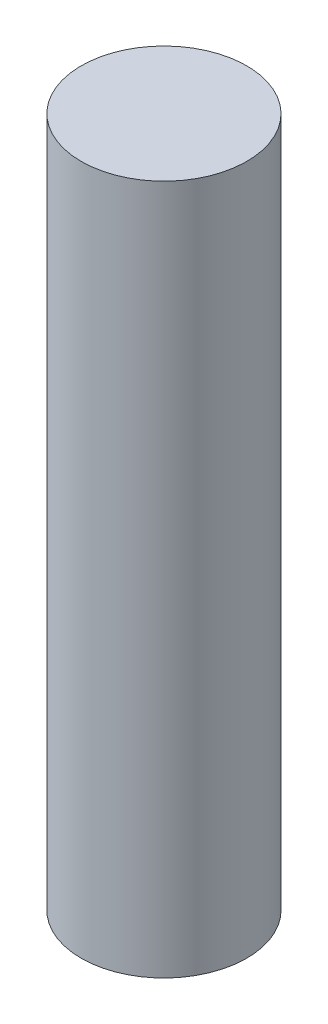
ISO-10303-21;
HEADER;
FILE_DESCRIPTION(('STEP AP214'),'2;1');
FILE_NAME('part.step','',(''),(''),'','','');
FILE_SCHEMA(('AUTOMOTIVE_DESIGN { 1 0 10303 214 1 1 1 1 }'));
ENDSEC;
DATA;
#1=APPLICATION_CONTEXT('core data for automotive mechanical design processes');
#2=APPLICATION_PROTOCOL_DEFINITION('international standard','automotive_design',2000,#1);
#3=PRODUCT_CONTEXT('',#1,'mechanical');
#4=PRODUCT('Part','Part','',(#3));
#5=PRODUCT_RELATED_PRODUCT_CATEGORY('part','',(#4));
#6=PRODUCT_DEFINITION_FORMATION('','',#4);
#7=PRODUCT_DEFINITION_CONTEXT('part definition',#1,'design');
#8=PRODUCT_DEFINITION('design','',#6,#7);
#9=PRODUCT_DEFINITION_SHAPE('','',#8);
#10=(LENGTH_UNIT() NAMED_UNIT(*) SI_UNIT(.MILLI.,.METRE.));
#11=(NAMED_UNIT(*) PLANE_ANGLE_UNIT() SI_UNIT($,.RADIAN.));
#12=(NAMED_UNIT(*) SI_UNIT($,.STERADIAN.) SOLID_ANGLE_UNIT());
#13=UNCERTAINTY_MEASURE_WITH_UNIT(LENGTH_MEASURE(1.E-05),#10,'distance_accuracy_value','');
#14=(GEOMETRIC_REPRESENTATION_CONTEXT(3) GLOBAL_UNCERTAINTY_ASSIGNED_CONTEXT((#13)) GLOBAL_UNIT_ASSIGNED_CONTEXT((#10,
#11,#12)) REPRESENTATION_CONTEXT('',''));
#15=CARTESIAN_POINT('',(0.,0.,0.));
#16=DIRECTION('',(0.,0.,1.));
#17=DIRECTION('',(1.,0.,0.));
#18=AXIS2_PLACEMENT_3D('',#15,#16,#17);
#19=CARTESIAN_POINT('',(0.,100.,0.));
#20=DIRECTION('',(0.,-1.,0.));
#21=DIRECTION('',(0.,0.,-1.));
#22=AXIS2_PLACEMENT_3D('',#19,#20,#21);
#23=CYLINDRICAL_SURFACE('',#22,12.);
#24=CARTESIAN_POINT('',(0.,100.,0.));
#25=DIRECTION('',(0.,1.,0.));
#26=DIRECTION('',(0.,0.,1.));
#27=AXIS2_PLACEMENT_3D('',#24,#25,#26);
#28=CIRCLE('',#27,12.);
#29=CARTESIAN_POINT('',(0.,100.,12.));
#30=VERTEX_POINT('',#29);
#31=EDGE_CURVE('E10',#30,#30,#28,.T.);
#32=ORIENTED_EDGE('',*,*,#31,.F.);
#33=EDGE_LOOP('',(#32));
#34=FACE_BOUND('',#33,.T.);
#35=CARTESIAN_POINT('',(0.,0.,0.));
#36=DIRECTION('',(0.,1.,0.));
#37=DIRECTION('',(0.,0.,1.));
#38=AXIS2_PLACEMENT_3D('',#35,#36,#37);
#39=CIRCLE('',#38,12.);
#40=CARTESIAN_POINT('',(0.,0.,12.));
#41=VERTEX_POINT('',#40);
#42=EDGE_CURVE('E34',#41,#41,#39,.T.);
#43=ORIENTED_EDGE('',*,*,#42,.T.);
#44=EDGE_LOOP('',(#43));
#45=FACE_BOUND('',#44,.T.);
#46=ADVANCED_FACE('F31',(#34,#45),#23,.T.);
#47=CARTESIAN_POINT('',(0.,100.,0.));
#48=DIRECTION('',(0.,1.,0.));
#49=DIRECTION('',(0.,0.,1.));
#50=AXIS2_PLACEMENT_3D('',#47,#48,#49);
#51=PLANE('',#50);
#52=ORIENTED_EDGE('',*,*,#31,.T.);
#53=EDGE_LOOP('',(#52));
#54=FACE_BOUND('',#53,.T.);
#55=ADVANCED_FACE('F46',(#54),#51,.T.);
#56=CARTESIAN_POINT('',(0.,0.,0.));
#57=DIRECTION('',(0.,1.,0.));
#58=DIRECTION('',(0.,0.,1.));
#59=AXIS2_PLACEMENT_3D('',#56,#57,#58);
#60=PLANE('',#59);
#61=ORIENTED_EDGE('',*,*,#42,.F.);
#62=EDGE_LOOP('',(#61));
#63=FACE_BOUND('',#62,.T.);
#64=ADVANCED_FACE('F44',(#63),#60,.F.);
#65=CLOSED_SHELL('',(#46,#55,#64));
#66=MANIFOLD_SOLID_BREP('B2',#65);
#67=ADVANCED_BREP_SHAPE_REPRESENTATION('',(#18,#66),#14);
#68=SHAPE_DEFINITION_REPRESENTATION(#9,#67);
ENDSEC;
END-ISO-10303-21;
